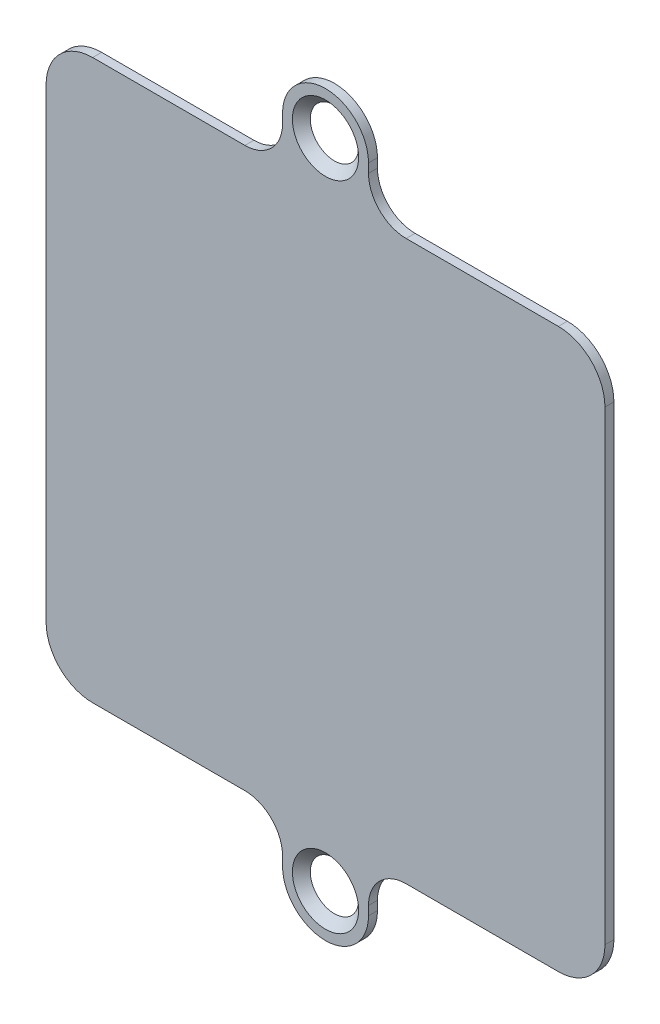
ISO-10303-21;
HEADER;
FILE_DESCRIPTION(('STEP AP214'),'2;1');
FILE_NAME('part.step','',(''),(''),'','','');
FILE_SCHEMA(('AUTOMOTIVE_DESIGN { 1 0 10303 214 1 1 1 1 }'));
ENDSEC;
DATA;
#1=APPLICATION_CONTEXT('core data for automotive mechanical design processes');
#2=APPLICATION_PROTOCOL_DEFINITION('international standard','automotive_design',2000,#1);
#3=PRODUCT_CONTEXT('',#1,'mechanical');
#4=PRODUCT('Part','Part','',(#3));
#5=PRODUCT_RELATED_PRODUCT_CATEGORY('part','',(#4));
#6=PRODUCT_DEFINITION_FORMATION('','',#4);
#7=PRODUCT_DEFINITION_CONTEXT('part definition',#1,'design');
#8=PRODUCT_DEFINITION('design','',#6,#7);
#9=PRODUCT_DEFINITION_SHAPE('','',#8);
#10=(LENGTH_UNIT() NAMED_UNIT(*) SI_UNIT(.MILLI.,.METRE.));
#11=(NAMED_UNIT(*) PLANE_ANGLE_UNIT() SI_UNIT($,.RADIAN.));
#12=(NAMED_UNIT(*) SI_UNIT($,.STERADIAN.) SOLID_ANGLE_UNIT());
#13=UNCERTAINTY_MEASURE_WITH_UNIT(LENGTH_MEASURE(1.E-05),#10,'distance_accuracy_value','');
#14=(GEOMETRIC_REPRESENTATION_CONTEXT(3) GLOBAL_UNCERTAINTY_ASSIGNED_CONTEXT((#13)) GLOBAL_UNIT_ASSIGNED_CONTEXT((#10,
#11,#12)) REPRESENTATION_CONTEXT('',''));
#15=CARTESIAN_POINT('',(0.,0.,0.));
#16=DIRECTION('',(0.,0.,1.));
#17=DIRECTION('',(1.,0.,0.));
#18=AXIS2_PLACEMENT_3D('',#15,#16,#17);
#19=CARTESIAN_POINT('',(-14.04,14.04,0.520033568648429));
#20=DIRECTION('',(0.,0.,1.));
#21=DIRECTION('',(1.,0.,0.));
#22=AXIS2_PLACEMENT_3D('',#19,#20,#21);
#23=PLANE('',#22);
#24=CARTESIAN_POINT('',(0.,-19.656,0.520033568648429));
#25=DIRECTION('',(0.,0.,1.));
#26=DIRECTION('',(1.,0.,0.));
#27=AXIS2_PLACEMENT_3D('',#24,#25,#26);
#28=CIRCLE('',#27,1.99800000000001);
#29=CARTESIAN_POINT('',(1.99800000000001,-19.656,0.520033568648429));
#30=VERTEX_POINT('',#29);
#31=EDGE_CURVE('E11',#30,#30,#28,.F.);
#32=ORIENTED_EDGE('',*,*,#31,.T.);
#33=EDGE_LOOP('',(#32));
#34=FACE_BOUND('',#33,.T.);
#35=CARTESIAN_POINT('',(0.,19.656,0.520033568648429));
#36=DIRECTION('',(0.,0.,1.));
#37=DIRECTION('',(1.,0.,0.));
#38=AXIS2_PLACEMENT_3D('',#35,#36,#37);
#39=CIRCLE('',#38,1.99800000000001);
#40=CARTESIAN_POINT('',(1.99800000000001,19.656,0.520033568648429));
#41=VERTEX_POINT('',#40);
#42=EDGE_CURVE('E47',#41,#41,#39,.F.);
#43=ORIENTED_EDGE('',*,*,#42,.T.);
#44=EDGE_LOOP('',(#43));
#45=FACE_BOUND('',#44,.T.);
#46=CARTESIAN_POINT('',(-14.04,14.04,0.520033568648429));
#47=DIRECTION('',(0.,0.,1.));
#48=DIRECTION('',(1.,0.,0.));
#49=AXIS2_PLACEMENT_3D('',#46,#47,#48);
#50=CIRCLE('',#49,2.808);
#51=CARTESIAN_POINT('',(-14.04,16.848,0.520033568648429));
#52=VERTEX_POINT('',#51);
#53=CARTESIAN_POINT('',(-16.848,14.04,0.520033568648429));
#54=VERTEX_POINT('',#53);
#55=EDGE_CURVE('E250',#52,#54,#50,.T.);
#56=ORIENTED_EDGE('',*,*,#55,.T.);
#57=DIRECTION('',(0.,-1.,0.));
#58=VECTOR('',#57,1.);
#59=CARTESIAN_POINT('',(-16.848,14.04,0.520033568648429));
#60=LINE('',#59,#58);
#61=CARTESIAN_POINT('',(-16.848,-14.04,0.520033568648429));
#62=VERTEX_POINT('',#61);
#63=EDGE_CURVE('E133',#54,#62,#60,.T.);
#64=ORIENTED_EDGE('',*,*,#63,.T.);
#65=CARTESIAN_POINT('',(-14.04,-14.04,0.520033568648429));
#66=DIRECTION('',(0.,0.,1.));
#67=DIRECTION('',(1.,0.,0.));
#68=AXIS2_PLACEMENT_3D('',#65,#66,#67);
#69=CIRCLE('',#68,2.808);
#70=CARTESIAN_POINT('',(-14.04,-16.848,0.520033568648429));
#71=VERTEX_POINT('',#70);
#72=EDGE_CURVE('E612',#62,#71,#69,.T.);
#73=ORIENTED_EDGE('',*,*,#72,.T.);
#74=DIRECTION('',(1.,0.,0.));
#75=VECTOR('',#74,1.);
#76=CARTESIAN_POINT('',(-14.04,-16.848,0.520033568648429));
#77=LINE('',#76,#75);
#78=CARTESIAN_POINT('',(-4.86000000000002,-16.848,0.520033568648429));
#79=VERTEX_POINT('',#78);
#80=EDGE_CURVE('E609',#71,#79,#77,.T.);
#81=ORIENTED_EDGE('',*,*,#80,.T.);
#82=CARTESIAN_POINT('',(-4.86,-19.116,0.520033568648429));
#83=DIRECTION('',(0.,0.,-1.));
#84=DIRECTION('',(-1.,0.,0.));
#85=AXIS2_PLACEMENT_3D('',#82,#83,#84);
#86=CIRCLE('',#85,2.268);
#87=CARTESIAN_POINT('',(-2.592,-19.116,0.520033568648429));
#88=VERTEX_POINT('',#87);
#89=EDGE_CURVE('E607',#79,#88,#86,.T.);
#90=ORIENTED_EDGE('',*,*,#89,.T.);
#91=DIRECTION('',(0.,-1.,0.));
#92=VECTOR('',#91,1.);
#93=CARTESIAN_POINT('',(-2.592,-19.656,0.520033568648429));
#94=LINE('',#93,#92);
#95=CARTESIAN_POINT('',(-2.592,-19.656,0.520033568648429));
#96=VERTEX_POINT('',#95);
#97=EDGE_CURVE('E602',#88,#96,#94,.T.);
#98=ORIENTED_EDGE('',*,*,#97,.T.);
#99=CARTESIAN_POINT('',(0.,-19.656,0.520033568648429));
#100=DIRECTION('',(0.,0.,1.));
#101=DIRECTION('',(-1.,0.,0.));
#102=AXIS2_PLACEMENT_3D('',#99,#100,#101);
#103=CIRCLE('',#102,2.592);
#104=CARTESIAN_POINT('',(2.592,-19.656,0.520033568648429));
#105=VERTEX_POINT('',#104);
#106=EDGE_CURVE('E599',#96,#105,#103,.T.);
#107=ORIENTED_EDGE('',*,*,#106,.T.);
#108=DIRECTION('',(0.,1.,0.));
#109=VECTOR('',#108,1.);
#110=CARTESIAN_POINT('',(2.592,-19.116,0.520033568648429));
#111=LINE('',#110,#109);
#112=CARTESIAN_POINT('',(2.592,-19.116,0.520033568648429));
#113=VERTEX_POINT('',#112);
#114=EDGE_CURVE('E597',#105,#113,#111,.T.);
#115=ORIENTED_EDGE('',*,*,#114,.T.);
#116=CARTESIAN_POINT('',(4.86,-19.116,0.520033568648429));
#117=DIRECTION('',(0.,0.,-1.));
#118=DIRECTION('',(1.,0.,0.));
#119=AXIS2_PLACEMENT_3D('',#116,#117,#118);
#120=CIRCLE('',#119,2.268);
#121=CARTESIAN_POINT('',(4.86000000000002,-16.848,0.520033568648429));
#122=VERTEX_POINT('',#121);
#123=EDGE_CURVE('E590',#113,#122,#120,.T.);
#124=ORIENTED_EDGE('',*,*,#123,.T.);
#125=DIRECTION('',(1.,0.,0.));
#126=VECTOR('',#125,1.);
#127=CARTESIAN_POINT('',(4.86000000000002,-16.848,0.520033568648429));
#128=LINE('',#127,#126);
#129=CARTESIAN_POINT('',(14.04,-16.848,0.520033568648429));
#130=VERTEX_POINT('',#129);
#131=EDGE_CURVE('E587',#122,#130,#128,.T.);
#132=ORIENTED_EDGE('',*,*,#131,.T.);
#133=CARTESIAN_POINT('',(14.04,-14.04,0.520033568648429));
#134=DIRECTION('',(0.,0.,1.));
#135=DIRECTION('',(1.,0.,0.));
#136=AXIS2_PLACEMENT_3D('',#133,#134,#135);
#137=CIRCLE('',#136,2.808);
#138=CARTESIAN_POINT('',(16.848,-14.04,0.520033568648429));
#139=VERTEX_POINT('',#138);
#140=EDGE_CURVE('E585',#130,#139,#137,.T.);
#141=ORIENTED_EDGE('',*,*,#140,.T.);
#142=DIRECTION('',(0.,1.,0.));
#143=VECTOR('',#142,1.);
#144=CARTESIAN_POINT('',(16.848,-14.04,0.520033568648429));
#145=LINE('',#144,#143);
#146=CARTESIAN_POINT('',(16.848,14.04,0.520033568648429));
#147=VERTEX_POINT('',#146);
#148=EDGE_CURVE('E579',#139,#147,#145,.T.);
#149=ORIENTED_EDGE('',*,*,#148,.T.);
#150=CARTESIAN_POINT('',(14.04,14.04,0.520033568648429));
#151=DIRECTION('',(0.,0.,1.));
#152=DIRECTION('',(1.,0.,0.));
#153=AXIS2_PLACEMENT_3D('',#150,#151,#152);
#154=CIRCLE('',#153,2.808);
#155=CARTESIAN_POINT('',(14.04,16.848,0.520033568648429));
#156=VERTEX_POINT('',#155);
#157=EDGE_CURVE('E577',#147,#156,#154,.T.);
#158=ORIENTED_EDGE('',*,*,#157,.T.);
#159=DIRECTION('',(-1.,0.,0.));
#160=VECTOR('',#159,1.);
#161=CARTESIAN_POINT('',(14.04,16.848,0.520033568648429));
#162=LINE('',#161,#160);
#163=CARTESIAN_POINT('',(4.86000000000002,16.848,0.520033568648429));
#164=VERTEX_POINT('',#163);
#165=EDGE_CURVE('E571',#156,#164,#162,.T.);
#166=ORIENTED_EDGE('',*,*,#165,.T.);
#167=CARTESIAN_POINT('',(4.86,19.116,0.520033568648429));
#168=DIRECTION('',(0.,0.,-1.));
#169=DIRECTION('',(-1.,0.,0.));
#170=AXIS2_PLACEMENT_3D('',#167,#168,#169);
#171=CIRCLE('',#170,2.268);
#172=CARTESIAN_POINT('',(2.592,19.116,0.520033568648429));
#173=VERTEX_POINT('',#172);
#174=EDGE_CURVE('E568',#164,#173,#171,.T.);
#175=ORIENTED_EDGE('',*,*,#174,.T.);
#176=DIRECTION('',(0.,1.,0.));
#177=VECTOR('',#176,1.);
#178=CARTESIAN_POINT('',(2.592,19.116,0.520033568648429));
#179=LINE('',#178,#177);
#180=CARTESIAN_POINT('',(2.592,19.656,0.520033568648429));
#181=VERTEX_POINT('',#180);
#182=EDGE_CURVE('E566',#173,#181,#179,.T.);
#183=ORIENTED_EDGE('',*,*,#182,.T.);
#184=CARTESIAN_POINT('',(0.,19.656,0.520033568648429));
#185=DIRECTION('',(0.,0.,1.));
#186=DIRECTION('',(1.,0.,0.));
#187=AXIS2_PLACEMENT_3D('',#184,#185,#186);
#188=CIRCLE('',#187,2.592);
#189=CARTESIAN_POINT('',(-2.592,19.656,0.520033568648429));
#190=VERTEX_POINT('',#189);
#191=EDGE_CURVE('E188',#181,#190,#188,.T.);
#192=ORIENTED_EDGE('',*,*,#191,.T.);
#193=DIRECTION('',(0.,-1.,0.));
#194=VECTOR('',#193,1.);
#195=CARTESIAN_POINT('',(-2.592,19.656,0.520033568648429));
#196=LINE('',#195,#194);
#197=CARTESIAN_POINT('',(-2.592,19.116,0.520033568648429));
#198=VERTEX_POINT('',#197);
#199=EDGE_CURVE('E182',#190,#198,#196,.T.);
#200=ORIENTED_EDGE('',*,*,#199,.T.);
#201=CARTESIAN_POINT('',(-4.86,19.116,0.520033568648429));
#202=DIRECTION('',(0.,0.,-1.));
#203=DIRECTION('',(1.,0.,0.));
#204=AXIS2_PLACEMENT_3D('',#201,#202,#203);
#205=CIRCLE('',#204,2.268);
#206=CARTESIAN_POINT('',(-4.86000000000002,16.848,0.520033568648429));
#207=VERTEX_POINT('',#206);
#208=EDGE_CURVE('E185',#198,#207,#205,.T.);
#209=ORIENTED_EDGE('',*,*,#208,.T.);
#210=DIRECTION('',(-1.,0.,0.));
#211=VECTOR('',#210,1.);
#212=CARTESIAN_POINT('',(-4.86000000000002,16.848,0.520033568648429));
#213=LINE('',#212,#211);
#214=EDGE_CURVE('E55',#207,#52,#213,.T.);
#215=ORIENTED_EDGE('',*,*,#214,.T.);
#216=EDGE_LOOP('',(#56,#64,#73,#81,#90,#98,#107,#115,#124,#132,#141,#149,#158,#166,#175,#183,
#192,#200,#209,#215));
#217=FACE_BOUND('',#216,.T.);
#218=ADVANCED_FACE('F38',(#34,#45,#217),#23,.T.);
#219=CARTESIAN_POINT('',(-14.04,14.04,-0.0199664313515709));
#220=DIRECTION('',(0.,0.,1.));
#221=DIRECTION('',(1.,0.,0.));
#222=AXIS2_PLACEMENT_3D('',#219,#220,#221);
#223=PLANE('',#222);
#224=CARTESIAN_POINT('',(0.,-19.656,-0.0199664313515709));
#225=DIRECTION('',(0.,0.,1.));
#226=DIRECTION('',(1.,0.,0.));
#227=AXIS2_PLACEMENT_3D('',#224,#225,#226);
#228=CIRCLE('',#227,1.45800000000001);
#229=CARTESIAN_POINT('',(1.45800000000001,-19.656,-0.0199664313515709));
#230=VERTEX_POINT('',#229);
#231=EDGE_CURVE('E304',#230,#230,#228,.T.);
#232=ORIENTED_EDGE('',*,*,#231,.T.);
#233=EDGE_LOOP('',(#232));
#234=FACE_BOUND('',#233,.T.);
#235=CARTESIAN_POINT('',(0.,19.656,-0.0199664313515709));
#236=DIRECTION('',(0.,0.,1.));
#237=DIRECTION('',(1.,0.,0.));
#238=AXIS2_PLACEMENT_3D('',#235,#236,#237);
#239=CIRCLE('',#238,1.45800000000001);
#240=CARTESIAN_POINT('',(1.45800000000001,19.656,-0.0199664313515709));
#241=VERTEX_POINT('',#240);
#242=EDGE_CURVE('E301',#241,#241,#239,.T.);
#243=ORIENTED_EDGE('',*,*,#242,.T.);
#244=EDGE_LOOP('',(#243));
#245=FACE_BOUND('',#244,.T.);
#246=CARTESIAN_POINT('',(-14.04,14.04,-0.0199664313515709));
#247=DIRECTION('',(0.,0.,1.));
#248=DIRECTION('',(1.,0.,0.));
#249=AXIS2_PLACEMENT_3D('',#246,#247,#248);
#250=CIRCLE('',#249,2.808);
#251=CARTESIAN_POINT('',(-14.04,16.848,-0.0199664313515709));
#252=VERTEX_POINT('',#251);
#253=CARTESIAN_POINT('',(-16.848,14.04,-0.0199664313515709));
#254=VERTEX_POINT('',#253);
#255=EDGE_CURVE('E208',#252,#254,#250,.T.);
#256=ORIENTED_EDGE('',*,*,#255,.F.);
#257=DIRECTION('',(-1.,0.,0.));
#258=VECTOR('',#257,1.);
#259=CARTESIAN_POINT('',(-13.5,16.848,-0.0199664313515709));
#260=LINE('',#259,#258);
#261=CARTESIAN_POINT('',(-4.86000000000002,16.848,-0.0199664313515709));
#262=VERTEX_POINT('',#261);
#263=EDGE_CURVE('E120',#262,#252,#260,.T.);
#264=ORIENTED_EDGE('',*,*,#263,.F.);
#265=CARTESIAN_POINT('',(-4.86,19.116,-0.0199664313515709));
#266=DIRECTION('',(0.,0.,-1.));
#267=DIRECTION('',(1.,0.,0.));
#268=AXIS2_PLACEMENT_3D('',#265,#266,#267);
#269=CIRCLE('',#268,2.268);
#270=CARTESIAN_POINT('',(-2.592,19.116,-0.0199664313515709));
#271=VERTEX_POINT('',#270);
#272=EDGE_CURVE('E247',#271,#262,#269,.T.);
#273=ORIENTED_EDGE('',*,*,#272,.F.);
#274=DIRECTION('',(0.,-1.,0.));
#275=VECTOR('',#274,1.);
#276=CARTESIAN_POINT('',(-2.592,19.656,-0.0199664313515709));
#277=LINE('',#276,#275);
#278=CARTESIAN_POINT('',(-2.592,19.656,-0.0199664313515709));
#279=VERTEX_POINT('',#278);
#280=EDGE_CURVE('E197',#279,#271,#277,.T.);
#281=ORIENTED_EDGE('',*,*,#280,.F.);
#282=CARTESIAN_POINT('',(0.,19.656,-0.0199664313515709));
#283=DIRECTION('',(0.,0.,1.));
#284=DIRECTION('',(1.,0.,0.));
#285=AXIS2_PLACEMENT_3D('',#282,#283,#284);
#286=CIRCLE('',#285,2.592);
#287=CARTESIAN_POINT('',(2.592,19.656,-0.0199664313515709));
#288=VERTEX_POINT('',#287);
#289=EDGE_CURVE('E244',#288,#279,#286,.T.);
#290=ORIENTED_EDGE('',*,*,#289,.F.);
#291=DIRECTION('',(0.,1.,0.));
#292=VECTOR('',#291,1.);
#293=CARTESIAN_POINT('',(2.592,19.116,-0.0199664313515709));
#294=LINE('',#293,#292);
#295=CARTESIAN_POINT('',(2.592,19.116,-0.0199664313515709));
#296=VERTEX_POINT('',#295);
#297=EDGE_CURVE('E242',#296,#288,#294,.T.);
#298=ORIENTED_EDGE('',*,*,#297,.F.);
#299=CARTESIAN_POINT('',(4.86,19.116,-0.0199664313515709));
#300=DIRECTION('',(0.,0.,-1.));
#301=DIRECTION('',(-1.,0.,0.));
#302=AXIS2_PLACEMENT_3D('',#299,#300,#301);
#303=CIRCLE('',#302,2.268);
#304=CARTESIAN_POINT('',(4.86000000000002,16.848,-0.0199664313515709));
#305=VERTEX_POINT('',#304);
#306=EDGE_CURVE('E240',#305,#296,#303,.T.);
#307=ORIENTED_EDGE('',*,*,#306,.F.);
#308=DIRECTION('',(-1.,0.,0.));
#309=VECTOR('',#308,1.);
#310=CARTESIAN_POINT('',(13.5,16.848,-0.0199664313515709));
#311=LINE('',#310,#309);
#312=CARTESIAN_POINT('',(14.04,16.848,-0.0199664313515709));
#313=VERTEX_POINT('',#312);
#314=EDGE_CURVE('E238',#313,#305,#311,.T.);
#315=ORIENTED_EDGE('',*,*,#314,.F.);
#316=CARTESIAN_POINT('',(14.04,14.04,-0.0199664313515709));
#317=DIRECTION('',(0.,0.,1.));
#318=DIRECTION('',(1.,0.,0.));
#319=AXIS2_PLACEMENT_3D('',#316,#317,#318);
#320=CIRCLE('',#319,2.808);
#321=CARTESIAN_POINT('',(16.848,14.04,-0.0199664313515709));
#322=VERTEX_POINT('',#321);
#323=EDGE_CURVE('E235',#322,#313,#320,.T.);
#324=ORIENTED_EDGE('',*,*,#323,.F.);
#325=DIRECTION('',(0.,1.,0.));
#326=VECTOR('',#325,1.);
#327=CARTESIAN_POINT('',(16.848,-14.04,-0.0199664313515709));
#328=LINE('',#327,#326);
#329=CARTESIAN_POINT('',(16.848,-14.04,-0.0199664313515709));
#330=VERTEX_POINT('',#329);
#331=EDGE_CURVE('E233',#330,#322,#328,.T.);
#332=ORIENTED_EDGE('',*,*,#331,.F.);
#333=CARTESIAN_POINT('',(14.04,-14.04,-0.0199664313515709));
#334=DIRECTION('',(0.,0.,1.));
#335=DIRECTION('',(1.,0.,0.));
#336=AXIS2_PLACEMENT_3D('',#333,#334,#335);
#337=CIRCLE('',#336,2.808);
#338=CARTESIAN_POINT('',(14.04,-16.848,-0.0199664313515709));
#339=VERTEX_POINT('',#338);
#340=EDGE_CURVE('E231',#339,#330,#337,.T.);
#341=ORIENTED_EDGE('',*,*,#340,.F.);
#342=DIRECTION('',(1.,0.,0.));
#343=VECTOR('',#342,1.);
#344=CARTESIAN_POINT('',(13.5,-16.848,-0.0199664313515709));
#345=LINE('',#344,#343);
#346=CARTESIAN_POINT('',(4.86000000000002,-16.848,-0.0199664313515709));
#347=VERTEX_POINT('',#346);
#348=EDGE_CURVE('E229',#347,#339,#345,.T.);
#349=ORIENTED_EDGE('',*,*,#348,.F.);
#350=CARTESIAN_POINT('',(4.86,-19.116,-0.0199664313515709));
#351=DIRECTION('',(0.,0.,-1.));
#352=DIRECTION('',(1.,0.,0.));
#353=AXIS2_PLACEMENT_3D('',#350,#351,#352);
#354=CIRCLE('',#353,2.268);
#355=CARTESIAN_POINT('',(2.592,-19.116,-0.0199664313515709));
#356=VERTEX_POINT('',#355);
#357=EDGE_CURVE('E226',#356,#347,#354,.T.);
#358=ORIENTED_EDGE('',*,*,#357,.F.);
#359=DIRECTION('',(0.,1.,0.));
#360=VECTOR('',#359,1.);
#361=CARTESIAN_POINT('',(2.592,-19.116,-0.0199664313515709));
#362=LINE('',#361,#360);
#363=CARTESIAN_POINT('',(2.592,-19.656,-0.0199664313515709));
#364=VERTEX_POINT('',#363);
#365=EDGE_CURVE('E224',#364,#356,#362,.T.);
#366=ORIENTED_EDGE('',*,*,#365,.F.);
#367=CARTESIAN_POINT('',(0.,-19.656,-0.0199664313515709));
#368=DIRECTION('',(0.,0.,1.));
#369=DIRECTION('',(-1.,0.,0.));
#370=AXIS2_PLACEMENT_3D('',#367,#368,#369);
#371=CIRCLE('',#370,2.592);
#372=CARTESIAN_POINT('',(-2.592,-19.656,-0.0199664313515709));
#373=VERTEX_POINT('',#372);
#374=EDGE_CURVE('E222',#373,#364,#371,.T.);
#375=ORIENTED_EDGE('',*,*,#374,.F.);
#376=DIRECTION('',(0.,-1.,0.));
#377=VECTOR('',#376,1.);
#378=CARTESIAN_POINT('',(-2.592,-19.656,-0.0199664313515709));
#379=LINE('',#378,#377);
#380=CARTESIAN_POINT('',(-2.592,-19.116,-0.0199664313515709));
#381=VERTEX_POINT('',#380);
#382=EDGE_CURVE('E220',#381,#373,#379,.T.);
#383=ORIENTED_EDGE('',*,*,#382,.F.);
#384=CARTESIAN_POINT('',(-4.86,-19.116,-0.0199664313515709));
#385=DIRECTION('',(0.,0.,-1.));
#386=DIRECTION('',(-1.,0.,0.));
#387=AXIS2_PLACEMENT_3D('',#384,#385,#386);
#388=CIRCLE('',#387,2.268);
#389=CARTESIAN_POINT('',(-4.86000000000002,-16.848,-0.0199664313515709));
#390=VERTEX_POINT('',#389);
#391=EDGE_CURVE('E218',#390,#381,#388,.T.);
#392=ORIENTED_EDGE('',*,*,#391,.F.);
#393=DIRECTION('',(1.,0.,0.));
#394=VECTOR('',#393,1.);
#395=CARTESIAN_POINT('',(-13.5,-16.848,-0.0199664313515709));
#396=LINE('',#395,#394);
#397=CARTESIAN_POINT('',(-14.04,-16.848,-0.0199664313515709));
#398=VERTEX_POINT('',#397);
#399=EDGE_CURVE('E216',#398,#390,#396,.T.);
#400=ORIENTED_EDGE('',*,*,#399,.F.);
#401=CARTESIAN_POINT('',(-14.04,-14.04,-0.0199664313515709));
#402=DIRECTION('',(0.,0.,1.));
#403=DIRECTION('',(1.,0.,0.));
#404=AXIS2_PLACEMENT_3D('',#401,#402,#403);
#405=CIRCLE('',#404,2.808);
#406=CARTESIAN_POINT('',(-16.848,-14.04,-0.0199664313515709));
#407=VERTEX_POINT('',#406);
#408=EDGE_CURVE('E213',#407,#398,#405,.T.);
#409=ORIENTED_EDGE('',*,*,#408,.F.);
#410=DIRECTION('',(0.,-1.,0.));
#411=VECTOR('',#410,1.);
#412=CARTESIAN_POINT('',(-16.848,14.04,-0.0199664313515709));
#413=LINE('',#412,#411);
#414=EDGE_CURVE('E211',#254,#407,#413,.T.);
#415=ORIENTED_EDGE('',*,*,#414,.F.);
#416=EDGE_LOOP('',(#256,#264,#273,#281,#290,#298,#307,#315,#324,#332,#341,#349,#358,#366,#375,
#383,#392,#400,#409,#415));
#417=FACE_BOUND('',#416,.T.);
#418=ADVANCED_FACE('F315',(#234,#245,#417),#223,.F.);
#419=CARTESIAN_POINT('',(-14.04,14.04,0.520033568648429));
#420=DIRECTION('',(0.,0.,-1.));
#421=DIRECTION('',(-1.,0.,0.));
#422=AXIS2_PLACEMENT_3D('',#419,#420,#421);
#423=CYLINDRICAL_SURFACE('',#422,2.808);
#424=ORIENTED_EDGE('',*,*,#255,.T.);
#425=DIRECTION('',(0.,0.,-1.));
#426=VECTOR('',#425,1.);
#427=CARTESIAN_POINT('',(-16.848,14.04,0.520033568648429));
#428=LINE('',#427,#426);
#429=EDGE_CURVE('E299',#54,#254,#428,.T.);
#430=ORIENTED_EDGE('',*,*,#429,.F.);
#431=ORIENTED_EDGE('',*,*,#55,.F.);
#432=DIRECTION('',(0.,0.,-1.));
#433=VECTOR('',#432,1.);
#434=CARTESIAN_POINT('',(-14.04,16.848,0.520033568648429));
#435=LINE('',#434,#433);
#436=EDGE_CURVE('E204',#52,#252,#435,.T.);
#437=ORIENTED_EDGE('',*,*,#436,.T.);
#438=EDGE_LOOP('',(#424,#430,#431,#437));
#439=FACE_BOUND('',#438,.T.);
#440=ADVANCED_FACE('F317',(#439),#423,.T.);
#441=CARTESIAN_POINT('',(-16.848,14.04,0.520033568648429));
#442=DIRECTION('',(1.,0.,0.));
#443=DIRECTION('',(0.,0.,-1.));
#444=AXIS2_PLACEMENT_3D('',#441,#442,#443);
#445=PLANE('',#444);
#446=ORIENTED_EDGE('',*,*,#414,.T.);
#447=DIRECTION('',(0.,0.,-1.));
#448=VECTOR('',#447,1.);
#449=CARTESIAN_POINT('',(-16.848,-14.04,0.520033568648429));
#450=LINE('',#449,#448);
#451=EDGE_CURVE('E296',#62,#407,#450,.T.);
#452=ORIENTED_EDGE('',*,*,#451,.F.);
#453=ORIENTED_EDGE('',*,*,#63,.F.);
#454=ORIENTED_EDGE('',*,*,#429,.T.);
#455=EDGE_LOOP('',(#446,#452,#453,#454));
#456=FACE_BOUND('',#455,.T.);
#457=ADVANCED_FACE('F351',(#456),#445,.F.);
#458=CARTESIAN_POINT('',(-14.04,-14.04,0.520033568648429));
#459=DIRECTION('',(0.,0.,-1.));
#460=DIRECTION('',(-1.,0.,0.));
#461=AXIS2_PLACEMENT_3D('',#458,#459,#460);
#462=CYLINDRICAL_SURFACE('',#461,2.808);
#463=ORIENTED_EDGE('',*,*,#408,.T.);
#464=DIRECTION('',(0.,0.,-1.));
#465=VECTOR('',#464,1.);
#466=CARTESIAN_POINT('',(-14.04,-16.848,0.520033568648429));
#467=LINE('',#466,#465);
#468=EDGE_CURVE('E293',#71,#398,#467,.T.);
#469=ORIENTED_EDGE('',*,*,#468,.F.);
#470=ORIENTED_EDGE('',*,*,#72,.F.);
#471=ORIENTED_EDGE('',*,*,#451,.T.);
#472=EDGE_LOOP('',(#463,#469,#470,#471));
#473=FACE_BOUND('',#472,.T.);
#474=ADVANCED_FACE('F358',(#473),#462,.T.);
#475=CARTESIAN_POINT('',(-13.5,-16.848,0.520033568648429));
#476=DIRECTION('',(0.,1.,0.));
#477=DIRECTION('',(0.,0.,1.));
#478=AXIS2_PLACEMENT_3D('',#475,#476,#477);
#479=PLANE('',#478);
#480=ORIENTED_EDGE('',*,*,#399,.T.);
#481=DIRECTION('',(0.,0.,-1.));
#482=VECTOR('',#481,1.);
#483=CARTESIAN_POINT('',(-4.86000000000002,-16.848,0.520033568648429));
#484=LINE('',#483,#482);
#485=EDGE_CURVE('E290',#79,#390,#484,.T.);
#486=ORIENTED_EDGE('',*,*,#485,.F.);
#487=ORIENTED_EDGE('',*,*,#80,.F.);
#488=ORIENTED_EDGE('',*,*,#468,.T.);
#489=EDGE_LOOP('',(#480,#486,#487,#488));
#490=FACE_BOUND('',#489,.T.);
#491=ADVANCED_FACE('F365',(#490),#479,.F.);
#492=CARTESIAN_POINT('',(-4.86,-19.116,0.520033568648429));
#493=DIRECTION('',(0.,0.,-1.));
#494=DIRECTION('',(-1.,0.,0.));
#495=AXIS2_PLACEMENT_3D('',#492,#493,#494);
#496=CYLINDRICAL_SURFACE('',#495,2.268);
#497=ORIENTED_EDGE('',*,*,#391,.T.);
#498=DIRECTION('',(0.,0.,-1.));
#499=VECTOR('',#498,1.);
#500=CARTESIAN_POINT('',(-2.592,-19.116,0.520033568648429));
#501=LINE('',#500,#499);
#502=EDGE_CURVE('E287',#88,#381,#501,.T.);
#503=ORIENTED_EDGE('',*,*,#502,.F.);
#504=ORIENTED_EDGE('',*,*,#89,.F.);
#505=ORIENTED_EDGE('',*,*,#485,.T.);
#506=EDGE_LOOP('',(#497,#503,#504,#505));
#507=FACE_BOUND('',#506,.T.);
#508=ADVANCED_FACE('F373',(#507),#496,.F.);
#509=CARTESIAN_POINT('',(-2.592,-19.656,0.520033568648429));
#510=DIRECTION('',(1.,0.,0.));
#511=DIRECTION('',(0.,1.,0.));
#512=AXIS2_PLACEMENT_3D('',#509,#510,#511);
#513=PLANE('',#512);
#514=ORIENTED_EDGE('',*,*,#382,.T.);
#515=DIRECTION('',(0.,0.,-1.));
#516=VECTOR('',#515,1.);
#517=CARTESIAN_POINT('',(-2.592,-19.656,0.520033568648429));
#518=LINE('',#517,#516);
#519=EDGE_CURVE('E284',#96,#373,#518,.T.);
#520=ORIENTED_EDGE('',*,*,#519,.F.);
#521=ORIENTED_EDGE('',*,*,#97,.F.);
#522=ORIENTED_EDGE('',*,*,#502,.T.);
#523=EDGE_LOOP('',(#514,#520,#521,#522));
#524=FACE_BOUND('',#523,.T.);
#525=ADVANCED_FACE('F381',(#524),#513,.F.);
#526=CARTESIAN_POINT('',(0.,-19.656,0.520033568648429));
#527=DIRECTION('',(0.,0.,-1.));
#528=DIRECTION('',(-1.,0.,0.));
#529=AXIS2_PLACEMENT_3D('',#526,#527,#528);
#530=CYLINDRICAL_SURFACE('',#529,2.592);
#531=ORIENTED_EDGE('',*,*,#374,.T.);
#532=DIRECTION('',(0.,0.,-1.));
#533=VECTOR('',#532,1.);
#534=CARTESIAN_POINT('',(2.592,-19.656,0.520033568648429));
#535=LINE('',#534,#533);
#536=EDGE_CURVE('E281',#105,#364,#535,.T.);
#537=ORIENTED_EDGE('',*,*,#536,.F.);
#538=ORIENTED_EDGE('',*,*,#106,.F.);
#539=ORIENTED_EDGE('',*,*,#519,.T.);
#540=EDGE_LOOP('',(#531,#537,#538,#539));
#541=FACE_BOUND('',#540,.T.);
#542=ADVANCED_FACE('F389',(#541),#530,.T.);
#543=CARTESIAN_POINT('',(2.592,-19.116,0.520033568648429));
#544=DIRECTION('',(-1.,0.,0.));
#545=DIRECTION('',(0.,0.,1.));
#546=AXIS2_PLACEMENT_3D('',#543,#544,#545);
#547=PLANE('',#546);
#548=ORIENTED_EDGE('',*,*,#365,.T.);
#549=DIRECTION('',(0.,0.,-1.));
#550=VECTOR('',#549,1.);
#551=CARTESIAN_POINT('',(2.592,-19.116,0.520033568648429));
#552=LINE('',#551,#550);
#553=EDGE_CURVE('E278',#113,#356,#552,.T.);
#554=ORIENTED_EDGE('',*,*,#553,.F.);
#555=ORIENTED_EDGE('',*,*,#114,.F.);
#556=ORIENTED_EDGE('',*,*,#536,.T.);
#557=EDGE_LOOP('',(#548,#554,#555,#556));
#558=FACE_BOUND('',#557,.T.);
#559=ADVANCED_FACE('F397',(#558),#547,.F.);
#560=CARTESIAN_POINT('',(4.86,-19.116,0.520033568648429));
#561=DIRECTION('',(0.,0.,-1.));
#562=DIRECTION('',(-1.,0.,0.));
#563=AXIS2_PLACEMENT_3D('',#560,#561,#562);
#564=CYLINDRICAL_SURFACE('',#563,2.268);
#565=ORIENTED_EDGE('',*,*,#357,.T.);
#566=DIRECTION('',(0.,0.,-1.));
#567=VECTOR('',#566,1.);
#568=CARTESIAN_POINT('',(4.86000000000002,-16.848,0.520033568648429));
#569=LINE('',#568,#567);
#570=EDGE_CURVE('E275',#122,#347,#569,.T.);
#571=ORIENTED_EDGE('',*,*,#570,.F.);
#572=ORIENTED_EDGE('',*,*,#123,.F.);
#573=ORIENTED_EDGE('',*,*,#553,.T.);
#574=EDGE_LOOP('',(#565,#571,#572,#573));
#575=FACE_BOUND('',#574,.T.);
#576=ADVANCED_FACE('F405',(#575),#564,.F.);
#577=CARTESIAN_POINT('',(13.5,-16.848,0.520033568648429));
#578=DIRECTION('',(0.,1.,0.));
#579=DIRECTION('',(-1.,0.,0.));
#580=AXIS2_PLACEMENT_3D('',#577,#578,#579);
#581=PLANE('',#580);
#582=ORIENTED_EDGE('',*,*,#348,.T.);
#583=DIRECTION('',(0.,0.,-1.));
#584=VECTOR('',#583,1.);
#585=CARTESIAN_POINT('',(14.04,-16.848,0.520033568648429));
#586=LINE('',#585,#584);
#587=EDGE_CURVE('E272',#130,#339,#586,.T.);
#588=ORIENTED_EDGE('',*,*,#587,.F.);
#589=ORIENTED_EDGE('',*,*,#131,.F.);
#590=ORIENTED_EDGE('',*,*,#570,.T.);
#591=EDGE_LOOP('',(#582,#588,#589,#590));
#592=FACE_BOUND('',#591,.T.);
#593=ADVANCED_FACE('F413',(#592),#581,.F.);
#594=CARTESIAN_POINT('',(14.04,-14.04,0.520033568648429));
#595=DIRECTION('',(0.,0.,-1.));
#596=DIRECTION('',(-1.,0.,0.));
#597=AXIS2_PLACEMENT_3D('',#594,#595,#596);
#598=CYLINDRICAL_SURFACE('',#597,2.808);
#599=ORIENTED_EDGE('',*,*,#340,.T.);
#600=DIRECTION('',(0.,0.,-1.));
#601=VECTOR('',#600,1.);
#602=CARTESIAN_POINT('',(16.848,-14.04,0.520033568648429));
#603=LINE('',#602,#601);
#604=EDGE_CURVE('E269',#139,#330,#603,.T.);
#605=ORIENTED_EDGE('',*,*,#604,.F.);
#606=ORIENTED_EDGE('',*,*,#140,.F.);
#607=ORIENTED_EDGE('',*,*,#587,.T.);
#608=EDGE_LOOP('',(#599,#605,#606,#607));
#609=FACE_BOUND('',#608,.T.);
#610=ADVANCED_FACE('F421',(#609),#598,.T.);
#611=CARTESIAN_POINT('',(16.848,-14.04,0.520033568648429));
#612=DIRECTION('',(-1.,0.,0.));
#613=DIRECTION('',(0.,0.,1.));
#614=AXIS2_PLACEMENT_3D('',#611,#612,#613);
#615=PLANE('',#614);
#616=ORIENTED_EDGE('',*,*,#331,.T.);
#617=DIRECTION('',(0.,0.,-1.));
#618=VECTOR('',#617,1.);
#619=CARTESIAN_POINT('',(16.848,14.04,0.520033568648429));
#620=LINE('',#619,#618);
#621=EDGE_CURVE('E266',#147,#322,#620,.T.);
#622=ORIENTED_EDGE('',*,*,#621,.F.);
#623=ORIENTED_EDGE('',*,*,#148,.F.);
#624=ORIENTED_EDGE('',*,*,#604,.T.);
#625=EDGE_LOOP('',(#616,#622,#623,#624));
#626=FACE_BOUND('',#625,.T.);
#627=ADVANCED_FACE('F429',(#626),#615,.F.);
#628=CARTESIAN_POINT('',(14.04,14.04,0.520033568648429));
#629=DIRECTION('',(0.,0.,-1.));
#630=DIRECTION('',(-1.,0.,0.));
#631=AXIS2_PLACEMENT_3D('',#628,#629,#630);
#632=CYLINDRICAL_SURFACE('',#631,2.808);
#633=ORIENTED_EDGE('',*,*,#323,.T.);
#634=DIRECTION('',(0.,0.,-1.));
#635=VECTOR('',#634,1.);
#636=CARTESIAN_POINT('',(14.04,16.848,0.520033568648429));
#637=LINE('',#636,#635);
#638=EDGE_CURVE('E263',#156,#313,#637,.T.);
#639=ORIENTED_EDGE('',*,*,#638,.F.);
#640=ORIENTED_EDGE('',*,*,#157,.F.);
#641=ORIENTED_EDGE('',*,*,#621,.T.);
#642=EDGE_LOOP('',(#633,#639,#640,#641));
#643=FACE_BOUND('',#642,.T.);
#644=ADVANCED_FACE('F437',(#643),#632,.T.);
#645=CARTESIAN_POINT('',(13.5,16.848,0.520033568648429));
#646=DIRECTION('',(0.,-1.,0.));
#647=DIRECTION('',(0.,0.,-1.));
#648=AXIS2_PLACEMENT_3D('',#645,#646,#647);
#649=PLANE('',#648);
#650=ORIENTED_EDGE('',*,*,#314,.T.);
#651=DIRECTION('',(0.,0.,-1.));
#652=VECTOR('',#651,1.);
#653=CARTESIAN_POINT('',(4.86000000000002,16.848,0.520033568648429));
#654=LINE('',#653,#652);
#655=EDGE_CURVE('E260',#164,#305,#654,.T.);
#656=ORIENTED_EDGE('',*,*,#655,.F.);
#657=ORIENTED_EDGE('',*,*,#165,.F.);
#658=ORIENTED_EDGE('',*,*,#638,.T.);
#659=EDGE_LOOP('',(#650,#656,#657,#658));
#660=FACE_BOUND('',#659,.T.);
#661=ADVANCED_FACE('F445',(#660),#649,.F.);
#662=CARTESIAN_POINT('',(4.86,19.116,0.520033568648429));
#663=DIRECTION('',(0.,0.,-1.));
#664=DIRECTION('',(-1.,0.,0.));
#665=AXIS2_PLACEMENT_3D('',#662,#663,#664);
#666=CYLINDRICAL_SURFACE('',#665,2.268);
#667=ORIENTED_EDGE('',*,*,#306,.T.);
#668=DIRECTION('',(0.,0.,-1.));
#669=VECTOR('',#668,1.);
#670=CARTESIAN_POINT('',(2.592,19.116,0.520033568648429));
#671=LINE('',#670,#669);
#672=EDGE_CURVE('E257',#173,#296,#671,.T.);
#673=ORIENTED_EDGE('',*,*,#672,.F.);
#674=ORIENTED_EDGE('',*,*,#174,.F.);
#675=ORIENTED_EDGE('',*,*,#655,.T.);
#676=EDGE_LOOP('',(#667,#673,#674,#675));
#677=FACE_BOUND('',#676,.T.);
#678=ADVANCED_FACE('F453',(#677),#666,.F.);
#679=CARTESIAN_POINT('',(2.592,19.116,0.520033568648429));
#680=DIRECTION('',(-1.,0.,0.));
#681=DIRECTION('',(0.,-1.,0.));
#682=AXIS2_PLACEMENT_3D('',#679,#680,#681);
#683=PLANE('',#682);
#684=ORIENTED_EDGE('',*,*,#297,.T.);
#685=DIRECTION('',(0.,0.,-1.));
#686=VECTOR('',#685,1.);
#687=CARTESIAN_POINT('',(2.592,19.656,0.520033568648429));
#688=LINE('',#687,#686);
#689=EDGE_CURVE('E254',#181,#288,#688,.T.);
#690=ORIENTED_EDGE('',*,*,#689,.F.);
#691=ORIENTED_EDGE('',*,*,#182,.F.);
#692=ORIENTED_EDGE('',*,*,#672,.T.);
#693=EDGE_LOOP('',(#684,#690,#691,#692));
#694=FACE_BOUND('',#693,.T.);
#695=ADVANCED_FACE('F461',(#694),#683,.F.);
#696=CARTESIAN_POINT('',(0.,19.656,0.520033568648429));
#697=DIRECTION('',(0.,0.,-1.));
#698=DIRECTION('',(-1.,0.,0.));
#699=AXIS2_PLACEMENT_3D('',#696,#697,#698);
#700=CYLINDRICAL_SURFACE('',#699,2.592);
#701=ORIENTED_EDGE('',*,*,#289,.T.);
#702=DIRECTION('',(0.,0.,-1.));
#703=VECTOR('',#702,1.);
#704=CARTESIAN_POINT('',(-2.592,19.656,0.520033568648429));
#705=LINE('',#704,#703);
#706=EDGE_CURVE('E199',#190,#279,#705,.T.);
#707=ORIENTED_EDGE('',*,*,#706,.F.);
#708=ORIENTED_EDGE('',*,*,#191,.F.);
#709=ORIENTED_EDGE('',*,*,#689,.T.);
#710=EDGE_LOOP('',(#701,#707,#708,#709));
#711=FACE_BOUND('',#710,.T.);
#712=ADVANCED_FACE('F469',(#711),#700,.T.);
#713=CARTESIAN_POINT('',(-2.592,19.656,0.520033568648429));
#714=DIRECTION('',(1.,0.,0.));
#715=DIRECTION('',(0.,0.,-1.));
#716=AXIS2_PLACEMENT_3D('',#713,#714,#715);
#717=PLANE('',#716);
#718=ORIENTED_EDGE('',*,*,#280,.T.);
#719=DIRECTION('',(0.,0.,-1.));
#720=VECTOR('',#719,1.);
#721=CARTESIAN_POINT('',(-2.592,19.116,0.520033568648429));
#722=LINE('',#721,#720);
#723=EDGE_CURVE('E194',#198,#271,#722,.T.);
#724=ORIENTED_EDGE('',*,*,#723,.F.);
#725=ORIENTED_EDGE('',*,*,#199,.F.);
#726=ORIENTED_EDGE('',*,*,#706,.T.);
#727=EDGE_LOOP('',(#718,#724,#725,#726));
#728=FACE_BOUND('',#727,.T.);
#729=ADVANCED_FACE('F195',(#728),#717,.F.);
#730=CARTESIAN_POINT('',(-4.86,19.116,0.520033568648429));
#731=DIRECTION('',(0.,0.,-1.));
#732=DIRECTION('',(-1.,0.,0.));
#733=AXIS2_PLACEMENT_3D('',#730,#731,#732);
#734=CYLINDRICAL_SURFACE('',#733,2.268);
#735=ORIENTED_EDGE('',*,*,#272,.T.);
#736=DIRECTION('',(0.,0.,-1.));
#737=VECTOR('',#736,1.);
#738=CARTESIAN_POINT('',(-4.86000000000002,16.848,0.520033568648429));
#739=LINE('',#738,#737);
#740=EDGE_CURVE('E200',#207,#262,#739,.T.);
#741=ORIENTED_EDGE('',*,*,#740,.F.);
#742=ORIENTED_EDGE('',*,*,#208,.F.);
#743=ORIENTED_EDGE('',*,*,#723,.T.);
#744=EDGE_LOOP('',(#735,#741,#742,#743));
#745=FACE_BOUND('',#744,.T.);
#746=ADVANCED_FACE('F202',(#745),#734,.F.);
#747=CARTESIAN_POINT('',(-13.5,16.848,0.520033568648429));
#748=DIRECTION('',(0.,-1.,0.));
#749=DIRECTION('',(1.,0.,0.));
#750=AXIS2_PLACEMENT_3D('',#747,#748,#749);
#751=PLANE('',#750);
#752=ORIENTED_EDGE('',*,*,#263,.T.);
#753=ORIENTED_EDGE('',*,*,#436,.F.);
#754=ORIENTED_EDGE('',*,*,#214,.F.);
#755=ORIENTED_EDGE('',*,*,#740,.T.);
#756=EDGE_LOOP('',(#752,#753,#754,#755));
#757=FACE_BOUND('',#756,.T.);
#758=ADVANCED_FACE('F324',(#757),#751,.F.);
#759=CARTESIAN_POINT('',(0.,-19.656,-0.397966431351587));
#760=DIRECTION('',(0.,0.,1.));
#761=DIRECTION('',(1.,0.,0.));
#762=AXIS2_PLACEMENT_3D('',#759,#760,#761);
#763=CONICAL_SURFACE('',#762,1.08,0.785398163397443);
#764=ORIENTED_EDGE('',*,*,#31,.F.);
#765=EDGE_LOOP('',(#764));
#766=FACE_BOUND('',#765,.T.);
#767=ORIENTED_EDGE('',*,*,#231,.F.);
#768=EDGE_LOOP('',(#767));
#769=FACE_BOUND('',#768,.T.);
#770=ADVANCED_FACE('F312',(#766,#769),#763,.F.);
#771=CARTESIAN_POINT('',(0.,19.656,-0.397966431351587));
#772=DIRECTION('',(0.,0.,1.));
#773=DIRECTION('',(1.,0.,0.));
#774=AXIS2_PLACEMENT_3D('',#771,#772,#773);
#775=CONICAL_SURFACE('',#774,1.08,0.785398163397443);
#776=ORIENTED_EDGE('',*,*,#42,.F.);
#777=EDGE_LOOP('',(#776));
#778=FACE_BOUND('',#777,.T.);
#779=ORIENTED_EDGE('',*,*,#242,.F.);
#780=EDGE_LOOP('',(#779));
#781=FACE_BOUND('',#780,.T.);
#782=ADVANCED_FACE('F40',(#778,#781),#775,.F.);
#783=CLOSED_SHELL('',(#218,#418,#440,#457,#474,#491,#508,#525,#542,#559,#576,#593,#610,#627,
#644,#661,#678,#695,#712,#729,#746,#758,#770,#782));
#784=MANIFOLD_SOLID_BREP('B2',#783);
#785=ADVANCED_BREP_SHAPE_REPRESENTATION('',(#18,#784),#14);
#786=SHAPE_DEFINITION_REPRESENTATION(#9,#785);
ENDSEC;
END-ISO-10303-21;
